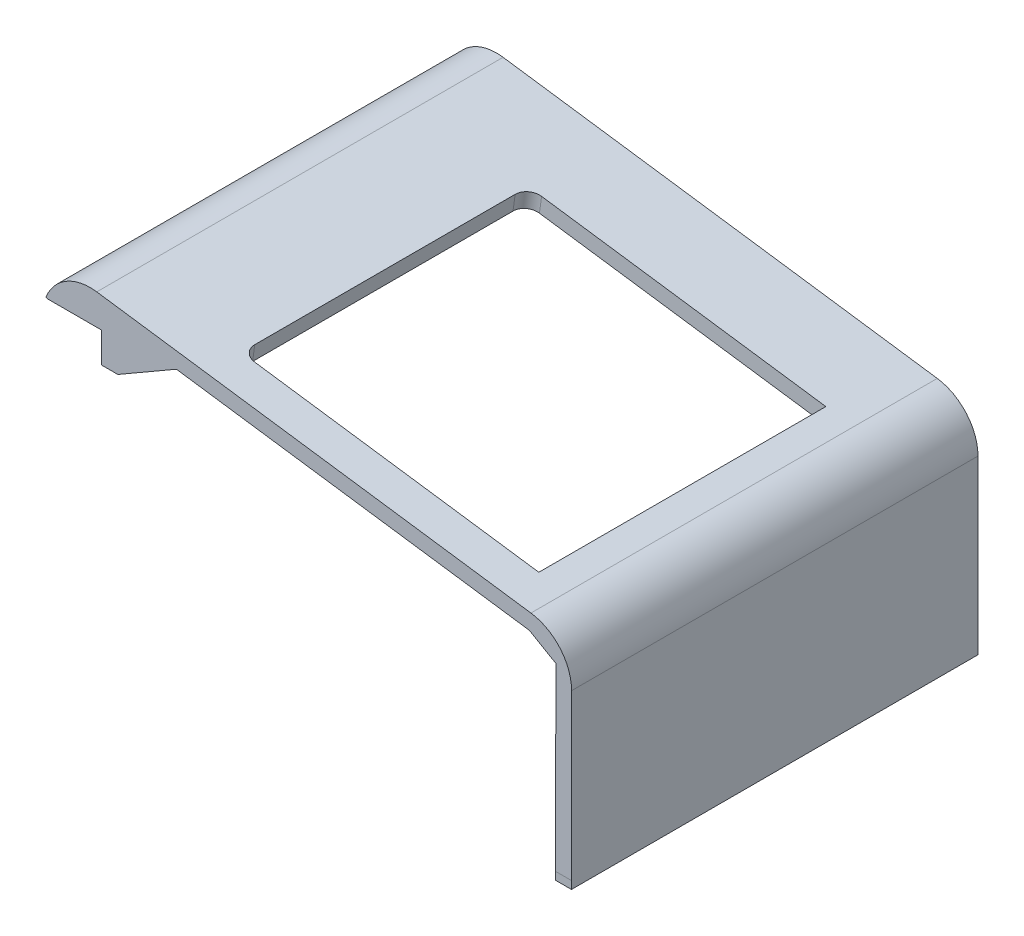
ISO-10303-21;
HEADER;
FILE_DESCRIPTION(('STEP AP214'),'2;1');
FILE_NAME('part.step','',(''),(''),'','','');
FILE_SCHEMA(('AUTOMOTIVE_DESIGN { 1 0 10303 214 1 1 1 1 }'));
ENDSEC;
DATA;
#1=APPLICATION_CONTEXT('core data for automotive mechanical design processes');
#2=APPLICATION_PROTOCOL_DEFINITION('international standard','automotive_design',2000,#1);
#3=PRODUCT_CONTEXT('',#1,'mechanical');
#4=PRODUCT('Part','Part','',(#3));
#5=PRODUCT_RELATED_PRODUCT_CATEGORY('part','',(#4));
#6=PRODUCT_DEFINITION_FORMATION('','',#4);
#7=PRODUCT_DEFINITION_CONTEXT('part definition',#1,'design');
#8=PRODUCT_DEFINITION('design','',#6,#7);
#9=PRODUCT_DEFINITION_SHAPE('','',#8);
#10=(LENGTH_UNIT() NAMED_UNIT(*) SI_UNIT(.MILLI.,.METRE.));
#11=(NAMED_UNIT(*) PLANE_ANGLE_UNIT() SI_UNIT($,.RADIAN.));
#12=(NAMED_UNIT(*) SI_UNIT($,.STERADIAN.) SOLID_ANGLE_UNIT());
#13=UNCERTAINTY_MEASURE_WITH_UNIT(LENGTH_MEASURE(1.E-05),#10,'distance_accuracy_value','');
#14=(GEOMETRIC_REPRESENTATION_CONTEXT(3) GLOBAL_UNCERTAINTY_ASSIGNED_CONTEXT((#13)) GLOBAL_UNIT_ASSIGNED_CONTEXT((#10,
#11,#12)) REPRESENTATION_CONTEXT('',''));
#15=CARTESIAN_POINT('',(0.,0.,0.));
#16=DIRECTION('',(0.,0.,1.));
#17=DIRECTION('',(1.,0.,0.));
#18=AXIS2_PLACEMENT_3D('',#15,#16,#17);
#19=CARTESIAN_POINT('',(-842.6701356146,704.73658748005,534.));
#20=DIRECTION('',(-0.358145702435698,-0.933665708820261,0.));
#21=DIRECTION('',(0.933665708820261,-0.358145702435698,0.));
#22=AXIS2_PLACEMENT_3D('',#19,#20,#21);
#23=PLANE('',#22);
#24=DIRECTION('',(0.,0.,-1.));
#25=VECTOR('',#24,1.);
#26=CARTESIAN_POINT('',(-838.9354727793,703.3040046703,534.));
#27=LINE('',#26,#25);
#28=CARTESIAN_POINT('',(-838.9354727793,703.3040046703,1288.17370106159));
#29=VERTEX_POINT('',#28);
#30=CARTESIAN_POINT('',(-838.9354727793,703.3040046703,-241.));
#31=VERTEX_POINT('',#30);
#32=EDGE_CURVE('E283',#29,#31,#27,.T.);
#33=ORIENTED_EDGE('',*,*,#32,.F.);
#34=DIRECTION('',(-0.933665673388383,0.35814568884435,-0.0002754966837263));
#35=VECTOR('',#34,1.);
#36=CARTESIAN_POINT('',(-842.864125245577,704.811000144021,1288.1725418343));
#37=LINE('',#36,#35);
#38=CARTESIAN_POINT('',(-846.404798449858,706.169170289784,1288.17149708746));
#39=VERTEX_POINT('',#38);
#40=EDGE_CURVE('E240',#29,#39,#37,.T.);
#41=ORIENTED_EDGE('',*,*,#40,.T.);
#42=DIRECTION('',(0.,0.,1.));
#43=VECTOR('',#42,1.);
#44=CARTESIAN_POINT('',(-846.404798449858,706.169170289784,534.));
#45=LINE('',#44,#43);
#46=CARTESIAN_POINT('',(-846.404798449858,706.169170289784,-240.999999999993));
#47=VERTEX_POINT('',#46);
#48=EDGE_CURVE('E359',#39,#47,#45,.F.);
#49=ORIENTED_EDGE('',*,*,#48,.T.);
#50=DIRECTION('',(0.933665708820261,-0.358145702435698,0.));
#51=VECTOR('',#50,1.);
#52=CARTESIAN_POINT('',(-842.6701356146,704.73658748005,-241.));
#53=LINE('',#52,#51);
#54=EDGE_CURVE('E362',#47,#31,#53,.T.);
#55=ORIENTED_EDGE('',*,*,#54,.T.);
#56=EDGE_LOOP('',(#33,#41,#49,#55));
#57=FACE_BOUND('',#56,.T.);
#58=ADVANCED_FACE('F18',(#57),#23,.T.);
#59=CARTESIAN_POINT('',(-738.4354727793,703.3040046703,534.));
#60=DIRECTION('',(0.,-1.,0.));
#61=DIRECTION('',(0.,0.,-1.));
#62=AXIS2_PLACEMENT_3D('',#59,#60,#61);
#63=PLANE('',#62);
#64=DIRECTION('',(0.,0.,1.));
#65=VECTOR('',#64,1.);
#66=CARTESIAN_POINT('',(-637.9354727793,703.3040046703,534.));
#67=LINE('',#66,#65);
#68=CARTESIAN_POINT('',(-637.9354727793,703.3040046703,1288.17370106159));
#69=VERTEX_POINT('',#68);
#70=CARTESIAN_POINT('',(-637.9354727793,703.3040046703,-241.));
#71=VERTEX_POINT('',#70);
#72=EDGE_CURVE('E289',#69,#71,#67,.F.);
#73=ORIENTED_EDGE('',*,*,#72,.F.);
#74=DIRECTION('',(-1.,0.,0.));
#75=VECTOR('',#74,1.);
#76=CARTESIAN_POINT('',(-738.4354727793,703.3040046703,1288.17370106159));
#77=LINE('',#76,#75);
#78=EDGE_CURVE('E261',#69,#29,#77,.T.);
#79=ORIENTED_EDGE('',*,*,#78,.T.);
#80=ORIENTED_EDGE('',*,*,#32,.T.);
#81=DIRECTION('',(1.,0.,0.));
#82=VECTOR('',#81,1.);
#83=CARTESIAN_POINT('',(-738.4354727793,703.3040046703,-241.));
#84=LINE('',#83,#82);
#85=EDGE_CURVE('E398',#31,#71,#84,.T.);
#86=ORIENTED_EDGE('',*,*,#85,.T.);
#87=EDGE_LOOP('',(#73,#79,#80,#86));
#88=FACE_BOUND('',#87,.T.);
#89=ADVANCED_FACE('F464',(#88),#63,.T.);
#90=CARTESIAN_POINT('',(-637.9354727793,646.3040046703,534.));
#91=DIRECTION('',(-1.,0.,0.));
#92=DIRECTION('',(0.,-1.,0.));
#93=AXIS2_PLACEMENT_3D('',#90,#91,#92);
#94=PLANE('',#93);
#95=DIRECTION('',(0.,0.,-1.));
#96=VECTOR('',#95,1.);
#97=CARTESIAN_POINT('',(-637.9354727793,589.3040046703,534.));
#98=LINE('',#97,#96);
#99=CARTESIAN_POINT('',(-637.9354727793,589.3040046703,1288.26139336928));
#100=VERTEX_POINT('',#99);
#101=CARTESIAN_POINT('',(-637.9354727793,589.3040046703,-241.));
#102=VERTEX_POINT('',#101);
#103=EDGE_CURVE('E292',#100,#102,#98,.T.);
#104=ORIENTED_EDGE('',*,*,#103,.F.);
#105=DIRECTION('',(0.,0.999999704142143,-0.000769230541647779));
#106=VECTOR('',#105,1.);
#107=CARTESIAN_POINT('',(-637.9354727793,646.884171671018,1288.21710093313));
#108=LINE('',#107,#106);
#109=EDGE_CURVE('E258',#100,#69,#108,.T.);
#110=ORIENTED_EDGE('',*,*,#109,.T.);
#111=ORIENTED_EDGE('',*,*,#72,.T.);
#112=DIRECTION('',(0.,-1.,0.));
#113=VECTOR('',#112,1.);
#114=CARTESIAN_POINT('',(-637.9354727793,646.3040046703,-241.));
#115=LINE('',#114,#113);
#116=EDGE_CURVE('E394',#71,#102,#115,.T.);
#117=ORIENTED_EDGE('',*,*,#116,.T.);
#118=EDGE_LOOP('',(#104,#110,#111,#117));
#119=FACE_BOUND('',#118,.T.);
#120=ADVANCED_FACE('F461',(#119),#94,.T.);
#121=CARTESIAN_POINT('',(-606.9354727793,589.3040046703,534.));
#122=DIRECTION('',(0.,-1.,0.));
#123=DIRECTION('',(0.,0.,-1.));
#124=AXIS2_PLACEMENT_3D('',#121,#122,#123);
#125=PLANE('',#124);
#126=DIRECTION('',(0.,0.,1.));
#127=VECTOR('',#126,1.);
#128=CARTESIAN_POINT('',(-575.9354727793,589.3040046703,534.));
#129=LINE('',#128,#127);
#130=CARTESIAN_POINT('',(-575.9354727793,589.3040046703,1288.26139336928));
#131=VERTEX_POINT('',#130);
#132=CARTESIAN_POINT('',(-575.9354727793,589.3040046703,-241.));
#133=VERTEX_POINT('',#132);
#134=EDGE_CURVE('E295',#131,#133,#129,.F.);
#135=ORIENTED_EDGE('',*,*,#134,.F.);
#136=DIRECTION('',(-1.,0.,0.));
#137=VECTOR('',#136,1.);
#138=CARTESIAN_POINT('',(-606.9354727793,589.3040046703,1288.26139336928));
#139=LINE('',#138,#137);
#140=EDGE_CURVE('E255',#131,#100,#139,.T.);
#141=ORIENTED_EDGE('',*,*,#140,.T.);
#142=ORIENTED_EDGE('',*,*,#103,.T.);
#143=DIRECTION('',(1.,0.,0.));
#144=VECTOR('',#143,1.);
#145=CARTESIAN_POINT('',(-606.9354727793,589.3040046703,-241.));
#146=LINE('',#145,#144);
#147=EDGE_CURVE('E390',#102,#133,#146,.T.);
#148=ORIENTED_EDGE('',*,*,#147,.T.);
#149=EDGE_LOOP('',(#135,#141,#142,#148));
#150=FACE_BOUND('',#149,.T.);
#151=ADVANCED_FACE('F455',(#150),#125,.T.);
#152=CARTESIAN_POINT('',(-465.8041141277,652.88837423405,534.));
#153=DIRECTION('',(0.500000000000174,-0.866025403784338,0.));
#154=DIRECTION('',(0.866025403784338,0.500000000000174,0.));
#155=AXIS2_PLACEMENT_3D('',#152,#153,#154);
#156=PLANE('',#155);
#157=DIRECTION('',(0.,0.,1.));
#158=VECTOR('',#157,1.);
#159=CARTESIAN_POINT('',(-355.6727554761,716.4727437978,534.));
#160=LINE('',#159,#158);
#161=CARTESIAN_POINT('',(-355.672755476099,716.4727437978,1288.16357126226));
#162=VERTEX_POINT('',#161);
#163=CARTESIAN_POINT('',(-355.672755476099,716.4727437978,-241.));
#164=VERTEX_POINT('',#163);
#165=EDGE_CURVE('E298',#162,#164,#160,.F.);
#166=ORIENTED_EDGE('',*,*,#165,.F.);
#167=DIRECTION('',(-0.866025339729212,-0.49999996301793,0.000384615356167733));
#168=VECTOR('',#167,1.);
#169=CARTESIAN_POINT('',(-465.552896022733,653.033415074578,1288.2123707459));
#170=LINE('',#169,#168);
#171=EDGE_CURVE('E252',#162,#131,#170,.T.);
#172=ORIENTED_EDGE('',*,*,#171,.T.);
#173=ORIENTED_EDGE('',*,*,#134,.T.);
#174=DIRECTION('',(0.866025403784338,0.500000000000174,0.));
#175=VECTOR('',#174,1.);
#176=CARTESIAN_POINT('',(-465.8041141277,652.88837423405,-241.));
#177=LINE('',#176,#175);
#178=EDGE_CURVE('E386',#133,#164,#177,.T.);
#179=ORIENTED_EDGE('',*,*,#178,.T.);
#180=EDGE_LOOP('',(#166,#172,#173,#179));
#181=FACE_BOUND('',#180,.T.);
#182=ADVANCED_FACE('F452',(#181),#156,.T.);
#183=CARTESIAN_POINT('',(308.3829454089,623.14580130655,534.));
#184=DIRECTION('',(-0.139173100960052,-0.990268068741572,0.));
#185=DIRECTION('',(0.990268068741572,-0.139173100960052,0.));
#186=AXIS2_PLACEMENT_3D('',#183,#184,#185);
#187=PLANE('',#186);
#188=CARTESIAN_POINT('',(-202.698414144606,694.973602178834,1105.00000000042));
#189=DIRECTION('',(-0.13917310090138,-0.990268068749818,0.));
#190=DIRECTION('',(0.990268068749818,-0.13917310090138,0.));
#191=AXIS2_PLACEMENT_3D('',#188,#189,#190);
#192=CIRCLE('',#191,49.9999999994208);
#193=CARTESIAN_POINT('',(-252.211817558877,701.932257220339,1105.00000000021));
#194=VERTEX_POINT('',#193);
#195=CARTESIAN_POINT('',(-202.698414169959,694.973602182472,1154.99999999992));
#196=VERTEX_POINT('',#195);
#197=EDGE_CURVE('E299',#194,#196,#192,.F.);
#198=ORIENTED_EDGE('',*,*,#197,.T.);
#199=DIRECTION('',(0.990268068741572,-0.139173100960052,0.));
#200=VECTOR('',#199,1.);
#201=CARTESIAN_POINT('',(308.382945408901,623.14580130655,1155.));
#202=LINE('',#201,#200);
#203=CARTESIAN_POINT('',(866.791100142203,544.666653135718,1155.));
#204=VERTEX_POINT('',#203);
#205=EDGE_CURVE('E303',#196,#204,#202,.T.);
#206=ORIENTED_EDGE('',*,*,#205,.T.);
#207=DIRECTION('',(0.,0.,1.));
#208=VECTOR('',#207,1.);
#209=CARTESIAN_POINT('',(866.791100142203,544.666653135717,534.));
#210=LINE('',#209,#208);
#211=CARTESIAN_POINT('',(866.791100142203,544.666653135718,75.));
#212=VERTEX_POINT('',#211);
#213=EDGE_CURVE('E309',#204,#212,#210,.F.);
#214=ORIENTED_EDGE('',*,*,#213,.T.);
#215=DIRECTION('',(0.990268068741572,-0.139173100960052,0.));
#216=VECTOR('',#215,1.);
#217=CARTESIAN_POINT('',(308.3829454089,623.14580130655,75.));
#218=LINE('',#217,#216);
#219=CARTESIAN_POINT('',(-202.698414121641,694.973602178379,75.0000000006));
#220=VERTEX_POINT('',#219);
#221=EDGE_CURVE('E312',#212,#220,#218,.F.);
#222=ORIENTED_EDGE('',*,*,#221,.T.);
#223=CARTESIAN_POINT('',(-202.698414145174,694.973602181563,125.000000000346));
#224=DIRECTION('',(-0.139173100901381,-0.990268068749818,0.));
#225=DIRECTION('',(0.990268068749818,-0.139173100901381,0.));
#226=AXIS2_PLACEMENT_3D('',#223,#224,#225);
#227=CIRCLE('',#226,49.999999999146);
#228=CARTESIAN_POINT('',(-252.211817558808,701.932257223457,124.999999974911));
#229=VERTEX_POINT('',#228);
#230=EDGE_CURVE('E316',#220,#229,#227,.F.);
#231=ORIENTED_EDGE('',*,*,#230,.T.);
#232=DIRECTION('',(0.,0.,1.));
#233=VECTOR('',#232,1.);
#234=CARTESIAN_POINT('',(-252.211817535704,701.932257220566,534.));
#235=LINE('',#234,#233);
#236=EDGE_CURVE('E304',#229,#194,#235,.T.);
#237=ORIENTED_EDGE('',*,*,#236,.T.);
#238=EDGE_LOOP('',(#198,#206,#214,#222,#231,#237));
#239=FACE_BOUND('',#238,.T.);
#240=DIRECTION('',(0.,0.,1.));
#241=VECTOR('',#240,1.);
#242=CARTESIAN_POINT('',(972.4386462939,529.8188588153,534.));
#243=LINE('',#242,#241);
#244=CARTESIAN_POINT('',(972.4386462939,529.8188588153,1288.30715117379));
#245=VERTEX_POINT('',#244);
#246=CARTESIAN_POINT('',(972.438646293901,529.8188588153,-241.));
#247=VERTEX_POINT('',#246);
#248=EDGE_CURVE('E308',#245,#247,#243,.F.);
#249=ORIENTED_EDGE('',*,*,#248,.F.);
#250=DIRECTION('',(-0.990268063066823,0.139173100162518,-0.00010705623089412));
#251=VECTOR('',#250,1.);
#252=CARTESIAN_POINT('',(308.302985624959,623.157038921328,1288.23535257371));
#253=LINE('',#252,#251);
#254=EDGE_CURVE('E249',#245,#162,#253,.T.);
#255=ORIENTED_EDGE('',*,*,#254,.T.);
#256=ORIENTED_EDGE('',*,*,#165,.T.);
#257=DIRECTION('',(0.990268068741572,-0.139173100960052,0.));
#258=VECTOR('',#257,1.);
#259=CARTESIAN_POINT('',(308.3829454089,623.14580130655,-241.));
#260=LINE('',#259,#258);
#261=EDGE_CURVE('E382',#164,#247,#260,.T.);
#262=ORIENTED_EDGE('',*,*,#261,.T.);
#263=EDGE_LOOP('',(#249,#255,#256,#262));
#264=FACE_BOUND('',#263,.T.);
#265=ADVANCED_FACE('F445',(#239,#264),#187,.T.);
#266=CARTESIAN_POINT('',(1022.35154525695,501.00163316305,534.));
#267=DIRECTION('',(-0.499999999998679,-0.866025403785201,0.));
#268=DIRECTION('',(0.866025403785201,-0.499999999998679,0.));
#269=AXIS2_PLACEMENT_3D('',#266,#267,#268);
#270=PLANE('',#269);
#271=DIRECTION('',(0.,0.,1.));
#272=VECTOR('',#271,1.);
#273=CARTESIAN_POINT('',(1072.26444422,472.1844075108,534.));
#274=LINE('',#273,#272);
#275=CARTESIAN_POINT('',(1072.26444422,472.1844075108,1288.3514853671));
#276=VERTEX_POINT('',#275);
#277=CARTESIAN_POINT('',(1072.26444422,472.1844075108,-241.));
#278=VERTEX_POINT('',#277);
#279=EDGE_CURVE('E327',#276,#278,#274,.F.);
#280=ORIENTED_EDGE('',*,*,#279,.F.);
#281=DIRECTION('',(-0.866025339730075,0.499999963016435,-0.00038461535616637));
#282=VECTOR('',#281,1.);
#283=CARTESIAN_POINT('',(1022.10028823549,501.146696472027,1288.32920668328));
#284=LINE('',#283,#282);
#285=EDGE_CURVE('E246',#276,#245,#284,.T.);
#286=ORIENTED_EDGE('',*,*,#285,.T.);
#287=ORIENTED_EDGE('',*,*,#248,.T.);
#288=DIRECTION('',(0.866025403785201,-0.499999999998679,0.));
#289=VECTOR('',#288,1.);
#290=CARTESIAN_POINT('',(1022.35154525695,501.00163316305,-241.));
#291=LINE('',#290,#289);
#292=EDGE_CURVE('E378',#247,#278,#291,.T.);
#293=ORIENTED_EDGE('',*,*,#292,.T.);
#294=EDGE_LOOP('',(#280,#286,#287,#293));
#295=FACE_BOUND('',#294,.T.);
#296=ADVANCED_FACE('F441',(#295),#270,.T.);
#297=CARTESIAN_POINT('',(1072.26444422,133.1844075108,534.));
#298=DIRECTION('',(-1.,0.,0.));
#299=DIRECTION('',(0.,-1.,0.));
#300=AXIS2_PLACEMENT_3D('',#297,#298,#299);
#301=PLANE('',#300);
#302=DIRECTION('',(0.,-1.,0.));
#303=VECTOR('',#302,1.);
#304=CARTESIAN_POINT('',(1072.26444422,133.1844075108,-241.));
#305=LINE('',#304,#303);
#306=CARTESIAN_POINT('',(1072.26444422,-235.,-241.));
#307=VERTEX_POINT('',#306);
#308=EDGE_CURVE('E214',#278,#307,#305,.T.);
#309=ORIENTED_EDGE('',*,*,#308,.T.);
#310=DIRECTION('',(0.,0.,-1.));
#311=VECTOR('',#310,1.);
#312=CARTESIAN_POINT('',(1072.26444422,-235.,1288.87302382864));
#313=LINE('',#312,#311);
#314=CARTESIAN_POINT('',(1072.26444422,-235.,1288.87302382864));
#315=VERTEX_POINT('',#314);
#316=EDGE_CURVE('E209',#315,#307,#313,.T.);
#317=ORIENTED_EDGE('',*,*,#316,.F.);
#318=DIRECTION('',(0.,1.,0.));
#319=VECTOR('',#318,1.);
#320=CARTESIAN_POINT('',(1072.26444422,-373.3155924892,1288.87302382864));
#321=LINE('',#320,#319);
#322=CARTESIAN_POINT('',(1072.26444422,-205.8155924892,1288.87302382864));
#323=VERTEX_POINT('',#322);
#324=EDGE_CURVE('E200',#315,#323,#321,.T.);
#325=ORIENTED_EDGE('',*,*,#324,.T.);
#326=DIRECTION('',(0.,0.999999704142143,-0.000769230541647779));
#327=VECTOR('',#326,1.);
#328=CARTESIAN_POINT('',(1072.26444422,133.764878132401,1288.611808082));
#329=LINE('',#328,#327);
#330=EDGE_CURVE('E38',#323,#276,#329,.T.);
#331=ORIENTED_EDGE('',*,*,#330,.T.);
#332=ORIENTED_EDGE('',*,*,#279,.T.);
#333=EDGE_LOOP('',(#309,#317,#325,#331,#332));
#334=FACE_BOUND('',#333,.T.);
#335=ADVANCED_FACE('F212',(#334),#301,.T.);
#336=CARTESIAN_POINT('',(1131.76444422,130.7440079492,534.));
#337=DIRECTION('',(1.,0.,0.));
#338=DIRECTION('',(0.,1.,0.));
#339=AXIS2_PLACEMENT_3D('',#336,#337,#338);
#340=PLANE('',#339);
#341=DIRECTION('',(0.,-0.999999704142143,0.000769230541647779));
#342=VECTOR('',#341,1.);
#343=CARTESIAN_POINT('',(1131.76444422,131.324480014824,1288.61368531133));
#344=LINE('',#343,#342);
#345=CARTESIAN_POINT('',(1131.76444422,412.744007949144,1288.39720875112));
#346=VERTEX_POINT('',#345);
#347=CARTESIAN_POINT('',(1131.76444422,-205.8155924892,1288.87302382864));
#348=VERTEX_POINT('',#347);
#349=EDGE_CURVE('E48',#346,#348,#344,.T.);
#350=ORIENTED_EDGE('',*,*,#349,.T.);
#351=DIRECTION('',(0.,1.,0.));
#352=VECTOR('',#351,1.);
#353=CARTESIAN_POINT('',(1131.76444422,-373.3155924892,1288.87302382864));
#354=LINE('',#353,#352);
#355=CARTESIAN_POINT('',(1131.76444422,-235.,1288.87302382864));
#356=VERTEX_POINT('',#355);
#357=EDGE_CURVE('E208',#356,#348,#354,.T.);
#358=ORIENTED_EDGE('',*,*,#357,.F.);
#359=DIRECTION('',(0.,0.,1.));
#360=VECTOR('',#359,1.);
#361=CARTESIAN_POINT('',(1131.76444422,-235.,-241.));
#362=LINE('',#361,#360);
#363=CARTESIAN_POINT('',(1131.76444422,-235.,-241.));
#364=VERTEX_POINT('',#363);
#365=EDGE_CURVE('E224',#364,#356,#362,.T.);
#366=ORIENTED_EDGE('',*,*,#365,.F.);
#367=DIRECTION('',(0.,1.,0.));
#368=VECTOR('',#367,1.);
#369=CARTESIAN_POINT('',(1131.76444422,130.7440079492,-241.));
#370=LINE('',#369,#368);
#371=CARTESIAN_POINT('',(1131.76444422,412.744007949172,-240.999999999993));
#372=VERTEX_POINT('',#371);
#373=EDGE_CURVE('E372',#364,#372,#370,.T.);
#374=ORIENTED_EDGE('',*,*,#373,.T.);
#375=DIRECTION('',(0.,0.,1.));
#376=VECTOR('',#375,1.);
#377=CARTESIAN_POINT('',(1131.76444422,412.744007949144,534.));
#378=LINE('',#377,#376);
#379=EDGE_CURVE('E330',#372,#346,#378,.T.);
#380=ORIENTED_EDGE('',*,*,#379,.T.);
#381=EDGE_LOOP('',(#350,#358,#366,#374,#380));
#382=FACE_BOUND('',#381,.T.);
#383=ADVANCED_FACE('F426',(#382),#340,.T.);
#384=CARTESIAN_POINT('',(953.724444218865,412.744007948833,-6000241.));
#385=DIRECTION('',(0.,0.,1.));
#386=DIRECTION('',(0.,-1.,0.));
#387=AXIS2_PLACEMENT_3D('',#384,#385,#386);
#388=CYLINDRICAL_SURFACE('',#387,178.039999999947);
#389=CARTESIAN_POINT('',(953.7244442196,412.7440079492,1288.39720875112));
#390=DIRECTION('',(0.,0.000769230541647782,0.999999704142148));
#391=DIRECTION('',(0.,-0.999999704142143,0.000769230541647779));
#392=AXIS2_PLACEMENT_3D('',#389,#390,#391);
#393=ELLIPSE('',#392,178.040052674494,178.039999999947);
#394=CARTESIAN_POINT('',(978.5028231145,589.051334908,1288.26158773064));
#395=VERTEX_POINT('',#394);
#396=EDGE_CURVE('E231',#346,#395,#393,.T.);
#397=ORIENTED_EDGE('',*,*,#396,.F.);
#398=ORIENTED_EDGE('',*,*,#379,.F.);
#399=CARTESIAN_POINT('',(953.7244442196,412.7440079492,-240.999999999986));
#400=DIRECTION('',(0.,0.,1.));
#401=DIRECTION('',(0.,-1.,0.));
#402=AXIS2_PLACEMENT_3D('',#399,#400,#401);
#403=CIRCLE('',#402,178.039999999947);
#404=CARTESIAN_POINT('',(978.502823114518,589.051334907997,-240.999999999993));
#405=VERTEX_POINT('',#404);
#406=EDGE_CURVE('E368',#372,#405,#403,.T.);
#407=ORIENTED_EDGE('',*,*,#406,.T.);
#408=DIRECTION('',(0.,0.,1.));
#409=VECTOR('',#408,1.);
#410=CARTESIAN_POINT('',(978.5028231145,589.051334908,534.));
#411=LINE('',#410,#409);
#412=EDGE_CURVE('E334',#395,#405,#411,.F.);
#413=ORIENTED_EDGE('',*,*,#412,.F.);
#414=EDGE_LOOP('',(#397,#398,#407,#413));
#415=FACE_BOUND('',#414,.T.);
#416=ADVANCED_FACE('F425',(#415),#388,.T.);
#417=CARTESIAN_POINT('',(161.5316664027,703.86914320005,534.));
#418=DIRECTION('',(0.13917310096006,0.990268068741571,0.));
#419=DIRECTION('',(-0.990268068741571,0.13917310096006,0.));
#420=AXIS2_PLACEMENT_3D('',#417,#418,#419);
#421=PLANE('',#420);
#422=CARTESIAN_POINT('',(-194.417614641907,753.89455226923,125.000000000346));
#423=DIRECTION('',(-0.139173100901381,-0.990268068749818,0.));
#424=DIRECTION('',(0.990268068749818,-0.139173100901381,0.));
#425=AXIS2_PLACEMENT_3D('',#422,#423,#424);
#426=CIRCLE('',#425,49.999999999146);
#427=CARTESIAN_POINT('',(-243.931018053886,760.853207310884,124.999999974911));
#428=VERTEX_POINT('',#427);
#429=CARTESIAN_POINT('',(-194.417614616689,753.894552265686,75.0000000006));
#430=VERTEX_POINT('',#429);
#431=EDGE_CURVE('E339',#428,#430,#426,.T.);
#432=ORIENTED_EDGE('',*,*,#431,.T.);
#433=DIRECTION('',(-0.990268068741571,0.13917310096006,0.));
#434=VECTOR('',#433,1.);
#435=CARTESIAN_POINT('',(161.5316664027,703.86914320005,75.));
#436=LINE('',#435,#434);
#437=CARTESIAN_POINT('',(875.071899649403,603.587603225823,75.));
#438=VERTEX_POINT('',#437);
#439=EDGE_CURVE('E338',#430,#438,#436,.F.);
#440=ORIENTED_EDGE('',*,*,#439,.T.);
#441=DIRECTION('',(0.,0.,1.));
#442=VECTOR('',#441,1.);
#443=CARTESIAN_POINT('',(875.071899649404,603.587603225823,534.));
#444=LINE('',#443,#442);
#445=CARTESIAN_POINT('',(875.071899649404,603.587603225823,1155.));
#446=VERTEX_POINT('',#445);
#447=EDGE_CURVE('E333',#438,#446,#444,.T.);
#448=ORIENTED_EDGE('',*,*,#447,.T.);
#449=DIRECTION('',(-0.990268068741571,0.13917310096006,0.));
#450=VECTOR('',#449,1.);
#451=CARTESIAN_POINT('',(161.5316664027,703.86914320005,1155.));
#452=LINE('',#451,#450);
#453=CARTESIAN_POINT('',(-194.417614666075,753.894552274296,1154.99999999996));
#454=VERTEX_POINT('',#453);
#455=EDGE_CURVE('E348',#446,#454,#452,.T.);
#456=ORIENTED_EDGE('',*,*,#455,.T.);
#457=CARTESIAN_POINT('',(-194.417614640543,753.894552271959,1105.00000000042));
#458=DIRECTION('',(-0.13917310090138,-0.990268068749818,0.));
#459=DIRECTION('',(0.990268068749818,-0.13917310090138,0.));
#460=AXIS2_PLACEMENT_3D('',#457,#458,#459);
#461=CIRCLE('',#460,49.9999999994208);
#462=CARTESIAN_POINT('',(-243.931018053116,760.853207313226,1105.00000000021));
#463=VERTEX_POINT('',#462);
#464=EDGE_CURVE('E351',#454,#463,#461,.T.);
#465=ORIENTED_EDGE('',*,*,#464,.T.);
#466=DIRECTION('',(0.,0.,1.));
#467=VECTOR('',#466,1.);
#468=CARTESIAN_POINT('',(-243.931018028601,760.853207310695,534.));
#469=LINE('',#468,#467);
#470=EDGE_CURVE('E342',#463,#428,#469,.F.);
#471=ORIENTED_EDGE('',*,*,#470,.T.);
#472=EDGE_LOOP('',(#432,#440,#448,#456,#465,#471));
#473=FACE_BOUND('',#472,.T.);
#474=DIRECTION('',(0.,0.,1.));
#475=VECTOR('',#474,1.);
#476=CARTESIAN_POINT('',(-655.439490309039,818.686951492092,534.));
#477=LINE('',#476,#475);
#478=CARTESIAN_POINT('',(-655.439490309025,818.68695149209,-240.999999999993));
#479=VERTEX_POINT('',#478);
#480=CARTESIAN_POINT('',(-655.439490309039,818.686951492092,1288.08494494807));
#481=VERTEX_POINT('',#480);
#482=EDGE_CURVE('E337',#479,#481,#477,.T.);
#483=ORIENTED_EDGE('',*,*,#482,.T.);
#484=DIRECTION('',(0.990268063066822,-0.139173100162526,0.000107056230894126));
#485=VECTOR('',#484,1.);
#486=CARTESIAN_POINT('',(161.451713201709,703.880379889655,1288.17325769604));
#487=LINE('',#486,#485);
#488=EDGE_CURVE('E226',#481,#395,#487,.T.);
#489=ORIENTED_EDGE('',*,*,#488,.T.);
#490=ORIENTED_EDGE('',*,*,#412,.T.);
#491=DIRECTION('',(-0.990268068741571,0.13917310096006,0.));
#492=VECTOR('',#491,1.);
#493=CARTESIAN_POINT('',(161.5316664027,703.86914320005,-241.));
#494=LINE('',#493,#492);
#495=EDGE_CURVE('E363',#405,#479,#494,.T.);
#496=ORIENTED_EDGE('',*,*,#495,.T.);
#497=EDGE_LOOP('',(#483,#489,#490,#496));
#498=FACE_BOUND('',#497,.T.);
#499=ADVANCED_FACE('F418',(#473,#498),#421,.T.);
#500=CARTESIAN_POINT('',(-680.212302280635,642.419235255733,-6000241.));
#501=DIRECTION('',(0.,0.,1.));
#502=DIRECTION('',(0.,-1.,0.));
#503=AXIS2_PLACEMENT_3D('',#500,#501,#502);
#504=CYLINDRICAL_SURFACE('',#503,178.);
#505=CARTESIAN_POINT('',(-680.2123022799,642.4192352561,1288.22053549902));
#506=DIRECTION('',(0.,0.000769230541647782,0.999999704142148));
#507=DIRECTION('',(0.,-0.999999704142143,0.000769230541647779));
#508=AXIS2_PLACEMENT_3D('',#505,#506,#507);
#509=ELLIPSE('',#508,178.000052662715,178.);
#510=EDGE_CURVE('E27',#481,#39,#509,.T.);
#511=ORIENTED_EDGE('',*,*,#510,.F.);
#512=ORIENTED_EDGE('',*,*,#482,.F.);
#513=CARTESIAN_POINT('',(-680.2123022799,642.4192352561,-240.999999999986));
#514=DIRECTION('',(0.,0.,1.));
#515=DIRECTION('',(0.,-1.,0.));
#516=AXIS2_PLACEMENT_3D('',#513,#514,#515);
#517=CIRCLE('',#516,178.);
#518=EDGE_CURVE('E367',#479,#47,#517,.T.);
#519=ORIENTED_EDGE('',*,*,#518,.T.);
#520=ORIENTED_EDGE('',*,*,#48,.F.);
#521=EDGE_LOOP('',(#511,#512,#519,#520));
#522=FACE_BOUND('',#521,.T.);
#523=ADVANCED_FACE('F415',(#522),#504,.T.);
#524=CARTESIAN_POINT('',(870.9314998958,574.12712818075,615.));
#525=DIRECTION('',(0.990268068741386,-0.139173100961375,0.));
#526=DIRECTION('',(0.139173100961375,0.990268068741386,0.));
#527=AXIS2_PLACEMENT_3D('',#524,#525,#526);
#528=PLANE('',#527);
#529=DIRECTION('',(0.139173100961375,0.990268068741386,0.));
#530=VECTOR('',#529,1.);
#531=CARTESIAN_POINT('',(870.9314998958,574.12712818075,75.));
#532=LINE('',#531,#530);
#533=EDGE_CURVE('E279',#438,#212,#532,.F.);
#534=ORIENTED_EDGE('',*,*,#533,.T.);
#535=ORIENTED_EDGE('',*,*,#213,.F.);
#536=DIRECTION('',(0.139173100961375,0.990268068741386,0.));
#537=VECTOR('',#536,1.);
#538=CARTESIAN_POINT('',(870.9314998958,574.12712818075,1155.));
#539=LINE('',#538,#537);
#540=EDGE_CURVE('E264',#204,#446,#539,.T.);
#541=ORIENTED_EDGE('',*,*,#540,.T.);
#542=ORIENTED_EDGE('',*,*,#447,.F.);
#543=EDGE_LOOP('',(#534,#535,#541,#542));
#544=FACE_BOUND('',#543,.T.);
#545=ADVANCED_FACE('F497',(#544),#528,.F.);
#546=CARTESIAN_POINT('',(336.186742775375,649.2806026992,1155.));
#547=DIRECTION('',(0.,0.,1.));
#548=DIRECTION('',(0.,-1.,0.));
#549=AXIS2_PLACEMENT_3D('',#546,#547,#548);
#550=PLANE('',#549);
#551=DIRECTION('',(-0.13917310090138,-0.990268068749818,0.));
#552=VECTOR('',#551,1.);
#553=CARTESIAN_POINT('',(834844.187793591,5942362.30705119,1154.99999999961));
#554=LINE('',#553,#552);
#555=EDGE_CURVE('E268',#454,#196,#554,.T.);
#556=ORIENTED_EDGE('',*,*,#555,.F.);
#557=ORIENTED_EDGE('',*,*,#455,.F.);
#558=ORIENTED_EDGE('',*,*,#540,.F.);
#559=ORIENTED_EDGE('',*,*,#205,.F.);
#560=EDGE_LOOP('',(#556,#557,#558,#559));
#561=FACE_BOUND('',#560,.T.);
#562=ADVANCED_FACE('F501',(#561),#550,.F.);
#563=CARTESIAN_POINT('',(834844.187793641,5942362.30705118,1105.00000000019));
#564=DIRECTION('',(-0.13917310090138,-0.990268068749818,0.));
#565=DIRECTION('',(0.990268068749818,-0.13917310090138,0.));
#566=AXIS2_PLACEMENT_3D('',#563,#564,#565);
#567=CYLINDRICAL_SURFACE('',#566,49.9999999994208);
#568=ORIENTED_EDGE('',*,*,#464,.F.);
#569=ORIENTED_EDGE('',*,*,#555,.T.);
#570=ORIENTED_EDGE('',*,*,#197,.F.);
#571=DIRECTION('',(-0.13917310090138,-0.990268068749818,0.));
#572=VECTOR('',#571,1.);
#573=CARTESIAN_POINT('',(834794.674390205,5942369.26570622,1104.99999999976));
#574=LINE('',#573,#572);
#575=EDGE_CURVE('E271',#194,#463,#574,.F.);
#576=ORIENTED_EDGE('',*,*,#575,.T.);
#577=EDGE_LOOP('',(#568,#569,#570,#576));
#578=FACE_BOUND('',#577,.T.);
#579=ADVANCED_FACE('F531',(#578),#567,.F.);
#580=CARTESIAN_POINT('',(-248.07141778215,731.39273226565,615.));
#581=DIRECTION('',(-0.990268068741618,0.139173100959726,0.));
#582=DIRECTION('',(-0.139173100959726,-0.990268068741618,0.));
#583=AXIS2_PLACEMENT_3D('',#580,#581,#582);
#584=PLANE('',#583);
#585=DIRECTION('',(-0.139173100901381,-0.990268068749818,0.));
#586=VECTOR('',#585,1.);
#587=CARTESIAN_POINT('',(834794.674390206,5942369.26570622,124.999999946707));
#588=LINE('',#587,#586);
#589=EDGE_CURVE('E275',#428,#229,#588,.T.);
#590=ORIENTED_EDGE('',*,*,#589,.F.);
#591=ORIENTED_EDGE('',*,*,#470,.F.);
#592=ORIENTED_EDGE('',*,*,#575,.F.);
#593=ORIENTED_EDGE('',*,*,#236,.F.);
#594=EDGE_LOOP('',(#590,#591,#592,#593));
#595=FACE_BOUND('',#594,.T.);
#596=ADVANCED_FACE('F515',(#595),#584,.F.);
#597=CARTESIAN_POINT('',(834844.187793643,5942362.30705118,124.999999997578));
#598=DIRECTION('',(-0.139173100901381,-0.990268068749818,0.));
#599=DIRECTION('',(0.990268068749818,-0.139173100901381,0.));
#600=AXIS2_PLACEMENT_3D('',#597,#598,#599);
#601=CYLINDRICAL_SURFACE('',#600,49.999999999146);
#602=ORIENTED_EDGE('',*,*,#431,.F.);
#603=ORIENTED_EDGE('',*,*,#589,.T.);
#604=ORIENTED_EDGE('',*,*,#230,.F.);
#605=DIRECTION('',(-0.139173100901381,-0.990268068749818,0.));
#606=VECTOR('',#605,1.);
#607=CARTESIAN_POINT('',(834844.18779369,5942362.30705117,74.9999999984317));
#608=LINE('',#607,#606);
#609=EDGE_CURVE('E278',#220,#430,#608,.F.);
#610=ORIENTED_EDGE('',*,*,#609,.T.);
#611=EDGE_LOOP('',(#602,#603,#604,#610));
#612=FACE_BOUND('',#611,.T.);
#613=ADVANCED_FACE('F510',(#612),#601,.F.);
#614=CARTESIAN_POINT('',(336.186742775375,649.2806026992,75.));
#615=DIRECTION('',(0.,0.,-1.));
#616=DIRECTION('',(0.,1.,0.));
#617=AXIS2_PLACEMENT_3D('',#614,#615,#616);
#618=PLANE('',#617);
#619=ORIENTED_EDGE('',*,*,#533,.F.);
#620=ORIENTED_EDGE('',*,*,#439,.F.);
#621=ORIENTED_EDGE('',*,*,#609,.F.);
#622=ORIENTED_EDGE('',*,*,#221,.F.);
#623=EDGE_LOOP('',(#619,#620,#621,#622));
#624=FACE_BOUND('',#623,.T.);
#625=ADVANCED_FACE('F474',(#624),#618,.F.);
#626=CARTESIAN_POINT('',(147.94686857825,314.93356657355,-241.));
#627=DIRECTION('',(0.,0.,1.));
#628=DIRECTION('',(0.,-1.,0.));
#629=AXIS2_PLACEMENT_3D('',#626,#627,#628);
#630=PLANE('',#629);
#631=ORIENTED_EDGE('',*,*,#495,.F.);
#632=ORIENTED_EDGE('',*,*,#406,.F.);
#633=ORIENTED_EDGE('',*,*,#373,.F.);
#634=DIRECTION('',(1.,0.,0.));
#635=VECTOR('',#634,1.);
#636=CARTESIAN_POINT('',(1072.26444422,-235.,-241.));
#637=LINE('',#636,#635);
#638=EDGE_CURVE('E219',#307,#364,#637,.T.);
#639=ORIENTED_EDGE('',*,*,#638,.F.);
#640=ORIENTED_EDGE('',*,*,#308,.F.);
#641=ORIENTED_EDGE('',*,*,#292,.F.);
#642=ORIENTED_EDGE('',*,*,#261,.F.);
#643=ORIENTED_EDGE('',*,*,#178,.F.);
#644=ORIENTED_EDGE('',*,*,#147,.F.);
#645=ORIENTED_EDGE('',*,*,#116,.F.);
#646=ORIENTED_EDGE('',*,*,#85,.F.);
#647=ORIENTED_EDGE('',*,*,#54,.F.);
#648=ORIENTED_EDGE('',*,*,#518,.F.);
#649=EDGE_LOOP('',(#631,#632,#633,#639,#640,#641,#642,#643,#644,#645,#646,#647,#648));
#650=FACE_BOUND('',#649,.T.);
#651=ADVANCED_FACE('F20',(#650),#630,.F.);
#652=CARTESIAN_POINT('',(951.5000355274,411.848746346721,1288.39789741415));
#653=DIRECTION('',(0.,0.000769230541647782,0.999999704142148));
#654=DIRECTION('',(1.,1.19475668600357E-07,-9.19044830677959E-11));
#655=AXIS2_PLACEMENT_3D('',#652,#653,#654);
#656=PLANE('',#655);
#657=ORIENTED_EDGE('',*,*,#78,.F.);
#658=ORIENTED_EDGE('',*,*,#109,.F.);
#659=ORIENTED_EDGE('',*,*,#140,.F.);
#660=ORIENTED_EDGE('',*,*,#171,.F.);
#661=ORIENTED_EDGE('',*,*,#254,.F.);
#662=ORIENTED_EDGE('',*,*,#285,.F.);
#663=ORIENTED_EDGE('',*,*,#330,.F.);
#664=DIRECTION('',(1.,0.,0.));
#665=VECTOR('',#664,1.);
#666=CARTESIAN_POINT('',(951.5000355274,-205.8155924892,1288.87302382864));
#667=LINE('',#666,#665);
#668=EDGE_CURVE('E11',#348,#323,#667,.F.);
#669=ORIENTED_EDGE('',*,*,#668,.F.);
#670=ORIENTED_EDGE('',*,*,#349,.F.);
#671=ORIENTED_EDGE('',*,*,#396,.T.);
#672=ORIENTED_EDGE('',*,*,#488,.F.);
#673=ORIENTED_EDGE('',*,*,#510,.T.);
#674=ORIENTED_EDGE('',*,*,#40,.F.);
#675=EDGE_LOOP('',(#657,#658,#659,#660,#661,#662,#663,#669,#670,#671,#672,#673,#674));
#676=FACE_BOUND('',#675,.T.);
#677=ADVANCED_FACE('F413',(#676),#656,.T.);
#678=CARTESIAN_POINT('',(1131.76444422,-373.3155924892,1288.87302382864));
#679=DIRECTION('',(0.,0.,-1.));
#680=DIRECTION('',(1.,0.,0.));
#681=AXIS2_PLACEMENT_3D('',#678,#679,#680);
#682=PLANE('',#681);
#683=DIRECTION('',(-1.,0.,0.));
#684=VECTOR('',#683,1.);
#685=CARTESIAN_POINT('',(1131.76444422,-235.,1288.87302382864));
#686=LINE('',#685,#684);
#687=EDGE_CURVE('E205',#356,#315,#686,.T.);
#688=ORIENTED_EDGE('',*,*,#687,.F.);
#689=ORIENTED_EDGE('',*,*,#357,.T.);
#690=ORIENTED_EDGE('',*,*,#668,.T.);
#691=ORIENTED_EDGE('',*,*,#324,.F.);
#692=EDGE_LOOP('',(#688,#689,#690,#691));
#693=FACE_BOUND('',#692,.T.);
#694=ADVANCED_FACE('F202',(#693),#682,.F.);
#695=CARTESIAN_POINT('',(-890.,-235.,-459.014198454145));
#696=DIRECTION('',(0.,-1.,0.));
#697=DIRECTION('',(0.,0.,-1.));
#698=AXIS2_PLACEMENT_3D('',#695,#696,#697);
#699=PLANE('',#698);
#700=ORIENTED_EDGE('',*,*,#687,.T.);
#701=ORIENTED_EDGE('',*,*,#316,.T.);
#702=ORIENTED_EDGE('',*,*,#638,.T.);
#703=ORIENTED_EDGE('',*,*,#365,.T.);
#704=EDGE_LOOP('',(#700,#701,#702,#703));
#705=FACE_BOUND('',#704,.T.);
#706=ADVANCED_FACE('F222',(#705),#699,.T.);
#707=CLOSED_SHELL('',(#58,#89,#120,#151,#182,#265,#296,#335,#383,#416,#499,#523,#545,#562,#579,
#596,#613,#625,#651,#677,#694,#706));
#708=MANIFOLD_SOLID_BREP('B1',#707);
#709=ADVANCED_BREP_SHAPE_REPRESENTATION('',(#18,#708),#14);
#710=SHAPE_DEFINITION_REPRESENTATION(#9,#709);
ENDSEC;
END-ISO-10303-21;
